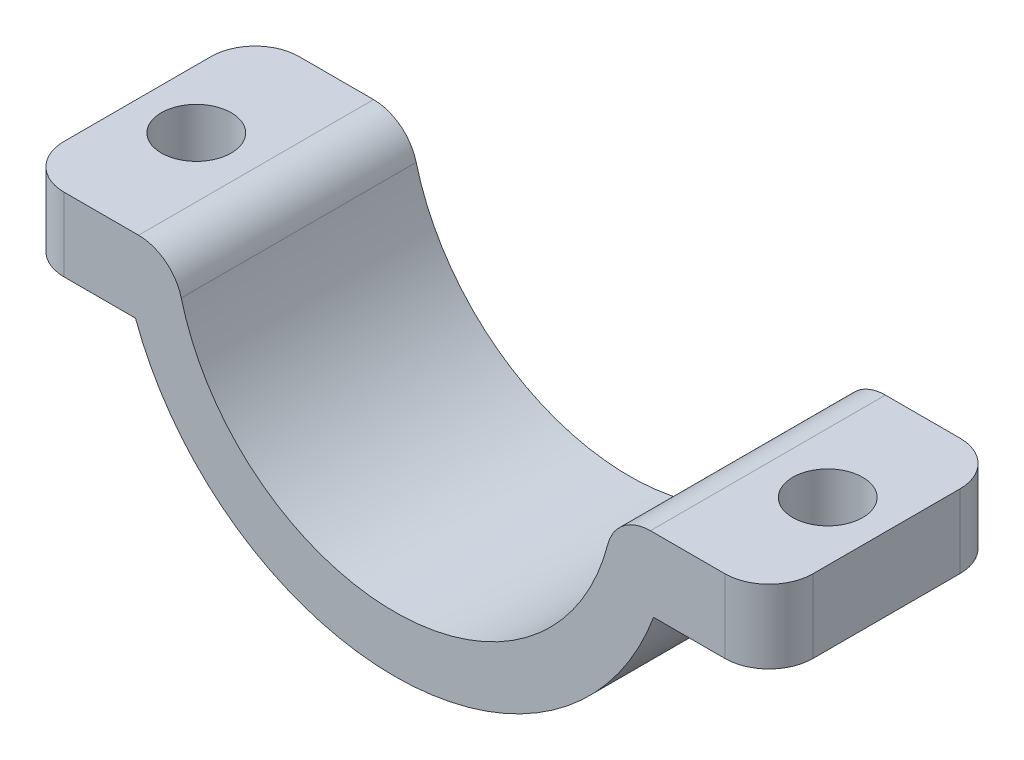
ISO-10303-21;
HEADER;
FILE_DESCRIPTION(('STEP AP214'),'2;1');
FILE_NAME('part.step','',(''),(''),'','','');
FILE_SCHEMA(('AUTOMOTIVE_DESIGN { 1 0 10303 214 1 1 1 1 }'));
ENDSEC;
DATA;
#1=APPLICATION_CONTEXT('core data for automotive mechanical design processes');
#2=APPLICATION_PROTOCOL_DEFINITION('international standard','automotive_design',2000,#1);
#3=PRODUCT_CONTEXT('',#1,'mechanical');
#4=PRODUCT('Part','Part','',(#3));
#5=PRODUCT_RELATED_PRODUCT_CATEGORY('part','',(#4));
#6=PRODUCT_DEFINITION_FORMATION('','',#4);
#7=PRODUCT_DEFINITION_CONTEXT('part definition',#1,'design');
#8=PRODUCT_DEFINITION('design','',#6,#7);
#9=PRODUCT_DEFINITION_SHAPE('','',#8);
#10=(LENGTH_UNIT() NAMED_UNIT(*) SI_UNIT(.MILLI.,.METRE.));
#11=(NAMED_UNIT(*) PLANE_ANGLE_UNIT() SI_UNIT($,.RADIAN.));
#12=(NAMED_UNIT(*) SI_UNIT($,.STERADIAN.) SOLID_ANGLE_UNIT());
#13=UNCERTAINTY_MEASURE_WITH_UNIT(LENGTH_MEASURE(1.E-05),#10,'distance_accuracy_value','');
#14=(GEOMETRIC_REPRESENTATION_CONTEXT(3) GLOBAL_UNCERTAINTY_ASSIGNED_CONTEXT((#13)) GLOBAL_UNIT_ASSIGNED_CONTEXT((#10,
#11,#12)) REPRESENTATION_CONTEXT('',''));
#15=CARTESIAN_POINT('',(0.,0.,0.));
#16=DIRECTION('',(0.,0.,1.));
#17=DIRECTION('',(1.,0.,0.));
#18=AXIS2_PLACEMENT_3D('',#15,#16,#17);
#19=CARTESIAN_POINT('',(0.,-1.5,8.));
#20=DIRECTION('',(0.,1.,0.));
#21=DIRECTION('',(-1.,0.,0.));
#22=AXIS2_PLACEMENT_3D('',#19,#20,#21);
#23=PLANE('',#22);
#24=CARTESIAN_POINT('',(21.5,-1.5,0.));
#25=DIRECTION('',(0.,1.,0.));
#26=DIRECTION('',(1.,0.,0.));
#27=AXIS2_PLACEMENT_3D('',#24,#25,#26);
#28=CIRCLE('',#27,2.38125);
#29=CARTESIAN_POINT('',(23.88125,-1.5,0.));
#30=VERTEX_POINT('',#29);
#31=EDGE_CURVE('E263',#30,#30,#28,.T.);
#32=ORIENTED_EDGE('',*,*,#31,.F.);
#33=EDGE_LOOP('',(#32));
#34=FACE_BOUND('',#33,.T.);
#35=DIRECTION('',(1.,0.,0.));
#36=VECTOR('',#35,1.);
#37=CARTESIAN_POINT('',(0.,-1.5,-8.));
#38=LINE('',#37,#36);
#39=CARTESIAN_POINT('',(17.4284250579334,-1.50000000000001,-8.));
#40=VERTEX_POINT('',#39);
#41=CARTESIAN_POINT('',(22.5,-1.50000000000001,-8.));
#42=VERTEX_POINT('',#41);
#43=EDGE_CURVE('E172',#40,#42,#38,.T.);
#44=ORIENTED_EDGE('',*,*,#43,.F.);
#45=DIRECTION('',(0.,0.,-1.));
#46=VECTOR('',#45,1.);
#47=CARTESIAN_POINT('',(17.4284250579334,-1.50000000000001,8.));
#48=LINE('',#47,#46);
#49=CARTESIAN_POINT('',(17.4284250579334,-1.50000000000001,8.));
#50=VERTEX_POINT('',#49);
#51=EDGE_CURVE('E222',#40,#50,#48,.F.);
#52=ORIENTED_EDGE('',*,*,#51,.T.);
#53=DIRECTION('',(1.,0.,0.));
#54=VECTOR('',#53,1.);
#55=CARTESIAN_POINT('',(0.,-1.5,8.));
#56=LINE('',#55,#54);
#57=CARTESIAN_POINT('',(22.5,-1.50000000000001,8.));
#58=VERTEX_POINT('',#57);
#59=EDGE_CURVE('E187',#50,#58,#56,.T.);
#60=ORIENTED_EDGE('',*,*,#59,.T.);
#61=CARTESIAN_POINT('',(22.5,-1.50000000000001,5.));
#62=DIRECTION('',(0.,1.,0.));
#63=DIRECTION('',(-1.,0.,0.));
#64=AXIS2_PLACEMENT_3D('',#61,#62,#63);
#65=CIRCLE('',#64,3.);
#66=CARTESIAN_POINT('',(25.5,-1.50000000000001,5.));
#67=VERTEX_POINT('',#66);
#68=EDGE_CURVE('E218',#58,#67,#65,.T.);
#69=ORIENTED_EDGE('',*,*,#68,.T.);
#70=DIRECTION('',(0.,0.,-1.));
#71=VECTOR('',#70,1.);
#72=CARTESIAN_POINT('',(25.5,-1.50000000000001,8.));
#73=LINE('',#72,#71);
#74=CARTESIAN_POINT('',(25.5,-1.50000000000001,-5.));
#75=VERTEX_POINT('',#74);
#76=EDGE_CURVE('E171',#67,#75,#73,.T.);
#77=ORIENTED_EDGE('',*,*,#76,.T.);
#78=CARTESIAN_POINT('',(22.5,-1.50000000000001,-5.));
#79=DIRECTION('',(0.,1.,0.));
#80=DIRECTION('',(-1.,0.,0.));
#81=AXIS2_PLACEMENT_3D('',#78,#79,#80);
#82=CIRCLE('',#81,3.);
#83=EDGE_CURVE('E220',#75,#42,#82,.T.);
#84=ORIENTED_EDGE('',*,*,#83,.T.);
#85=EDGE_LOOP('',(#44,#52,#60,#69,#77,#84));
#86=FACE_BOUND('',#85,.T.);
#87=ADVANCED_FACE('F35',(#34,#86),#23,.T.);
#88=CARTESIAN_POINT('',(0.,0.,8.));
#89=DIRECTION('',(0.,0.,-1.));
#90=DIRECTION('',(-1.,0.,0.));
#91=AXIS2_PLACEMENT_3D('',#88,#89,#90);
#92=CYLINDRICAL_SURFACE('',#91,15.);
#93=CARTESIAN_POINT('',(0.,0.,8.));
#94=DIRECTION('',(0.,0.,1.));
#95=DIRECTION('',(1.,0.,0.));
#96=AXIS2_PLACEMENT_3D('',#93,#94,#95);
#97=CIRCLE('',#96,15.);
#98=CARTESIAN_POINT('',(-14.5236875482778,-3.75000000000001,8.));
#99=VERTEX_POINT('',#98);
#100=CARTESIAN_POINT('',(14.5236875482778,-3.75000000000001,8.));
#101=VERTEX_POINT('',#100);
#102=EDGE_CURVE('E166',#99,#101,#97,.T.);
#103=ORIENTED_EDGE('',*,*,#102,.T.);
#104=DIRECTION('',(0.,0.,-1.));
#105=VECTOR('',#104,1.);
#106=CARTESIAN_POINT('',(14.5236875482778,-3.75000000000001,8.));
#107=LINE('',#106,#105);
#108=CARTESIAN_POINT('',(14.5236875482778,-3.75000000000001,-8.));
#109=VERTEX_POINT('',#108);
#110=EDGE_CURVE('E206',#101,#109,#107,.T.);
#111=ORIENTED_EDGE('',*,*,#110,.T.);
#112=CARTESIAN_POINT('',(0.,0.,-8.));
#113=DIRECTION('',(0.,0.,1.));
#114=DIRECTION('',(1.,0.,0.));
#115=AXIS2_PLACEMENT_3D('',#112,#113,#114);
#116=CIRCLE('',#115,15.);
#117=CARTESIAN_POINT('',(-14.5236875482778,-3.75000000000001,-8.));
#118=VERTEX_POINT('',#117);
#119=EDGE_CURVE('E175',#118,#109,#116,.T.);
#120=ORIENTED_EDGE('',*,*,#119,.F.);
#121=DIRECTION('',(0.,0.,-1.));
#122=VECTOR('',#121,1.);
#123=CARTESIAN_POINT('',(-14.5236875482778,-3.75000000000001,8.));
#124=LINE('',#123,#122);
#125=EDGE_CURVE('E198',#118,#99,#124,.F.);
#126=ORIENTED_EDGE('',*,*,#125,.T.);
#127=EDGE_LOOP('',(#103,#111,#120,#126));
#128=FACE_BOUND('',#127,.T.);
#129=ADVANCED_FACE('F275',(#128),#92,.F.);
#130=CARTESIAN_POINT('',(0.,-1.5,8.));
#131=DIRECTION('',(0.,-1.,0.));
#132=DIRECTION('',(1.,0.,0.));
#133=AXIS2_PLACEMENT_3D('',#130,#131,#132);
#134=PLANE('',#133);
#135=CARTESIAN_POINT('',(-21.5,-1.50000000000001,0.));
#136=DIRECTION('',(0.,1.,0.));
#137=DIRECTION('',(-1.,0.,0.));
#138=AXIS2_PLACEMENT_3D('',#135,#136,#137);
#139=CIRCLE('',#138,2.38125);
#140=CARTESIAN_POINT('',(-23.88125,-1.50000000000001,0.));
#141=VERTEX_POINT('',#140);
#142=EDGE_CURVE('E202',#141,#141,#139,.T.);
#143=ORIENTED_EDGE('',*,*,#142,.F.);
#144=EDGE_LOOP('',(#143));
#145=FACE_BOUND('',#144,.T.);
#146=DIRECTION('',(-1.,0.,0.));
#147=VECTOR('',#146,1.);
#148=CARTESIAN_POINT('',(0.,-1.5,8.));
#149=LINE('',#148,#147);
#150=CARTESIAN_POINT('',(-17.4284250579334,-1.50000000000001,8.));
#151=VERTEX_POINT('',#150);
#152=CARTESIAN_POINT('',(-22.5,-1.50000000000001,8.));
#153=VERTEX_POINT('',#152);
#154=EDGE_CURVE('E164',#151,#153,#149,.T.);
#155=ORIENTED_EDGE('',*,*,#154,.F.);
#156=DIRECTION('',(0.,0.,1.));
#157=VECTOR('',#156,1.);
#158=CARTESIAN_POINT('',(-17.4284250579334,-1.50000000000001,-8.));
#159=LINE('',#158,#157);
#160=CARTESIAN_POINT('',(-17.4284250579334,-1.50000000000001,-8.));
#161=VERTEX_POINT('',#160);
#162=EDGE_CURVE('E235',#151,#161,#159,.F.);
#163=ORIENTED_EDGE('',*,*,#162,.T.);
#164=DIRECTION('',(-1.,0.,0.));
#165=VECTOR('',#164,1.);
#166=CARTESIAN_POINT('',(0.,-1.5,-8.));
#167=LINE('',#166,#165);
#168=CARTESIAN_POINT('',(-22.5,-1.50000000000001,-8.));
#169=VERTEX_POINT('',#168);
#170=EDGE_CURVE('E179',#161,#169,#167,.T.);
#171=ORIENTED_EDGE('',*,*,#170,.T.);
#172=CARTESIAN_POINT('',(-22.5,-1.50000000000001,-5.));
#173=DIRECTION('',(0.,-1.,0.));
#174=DIRECTION('',(1.,0.,0.));
#175=AXIS2_PLACEMENT_3D('',#172,#173,#174);
#176=CIRCLE('',#175,3.);
#177=CARTESIAN_POINT('',(-25.5,-1.50000000000001,-5.));
#178=VERTEX_POINT('',#177);
#179=EDGE_CURVE('E231',#169,#178,#176,.F.);
#180=ORIENTED_EDGE('',*,*,#179,.T.);
#181=DIRECTION('',(0.,0.,-1.));
#182=VECTOR('',#181,1.);
#183=CARTESIAN_POINT('',(-25.5,-1.50000000000001,8.));
#184=LINE('',#183,#182);
#185=CARTESIAN_POINT('',(-25.5,-1.50000000000001,5.));
#186=VERTEX_POINT('',#185);
#187=EDGE_CURVE('E195',#186,#178,#184,.T.);
#188=ORIENTED_EDGE('',*,*,#187,.F.);
#189=CARTESIAN_POINT('',(-22.5,-1.50000000000001,5.));
#190=DIRECTION('',(0.,-1.,0.));
#191=DIRECTION('',(1.,0.,0.));
#192=AXIS2_PLACEMENT_3D('',#189,#190,#191);
#193=CIRCLE('',#192,3.);
#194=EDGE_CURVE('E233',#186,#153,#193,.F.);
#195=ORIENTED_EDGE('',*,*,#194,.T.);
#196=EDGE_LOOP('',(#155,#163,#171,#180,#188,#195));
#197=FACE_BOUND('',#196,.T.);
#198=ADVANCED_FACE('F271',(#145,#197),#134,.F.);
#199=CARTESIAN_POINT('',(-25.5,0.,8.));
#200=DIRECTION('',(1.,0.,0.));
#201=DIRECTION('',(0.,0.,-1.));
#202=AXIS2_PLACEMENT_3D('',#199,#200,#201);
#203=PLANE('',#202);
#204=DIRECTION('',(0.,0.,-1.));
#205=VECTOR('',#204,1.);
#206=CARTESIAN_POINT('',(-25.5,-6.50000000000001,8.));
#207=LINE('',#206,#205);
#208=CARTESIAN_POINT('',(-25.5,-6.50000000000001,5.));
#209=VERTEX_POINT('',#208);
#210=CARTESIAN_POINT('',(-25.5,-6.50000000000001,-5.));
#211=VERTEX_POINT('',#210);
#212=EDGE_CURVE('E146',#209,#211,#207,.T.);
#213=ORIENTED_EDGE('',*,*,#212,.F.);
#214=DIRECTION('',(0.,-1.,0.));
#215=VECTOR('',#214,1.);
#216=CARTESIAN_POINT('',(-25.5,-1.50000000000001,5.));
#217=LINE('',#216,#215);
#218=EDGE_CURVE('E245',#209,#186,#217,.F.);
#219=ORIENTED_EDGE('',*,*,#218,.T.);
#220=ORIENTED_EDGE('',*,*,#187,.T.);
#221=DIRECTION('',(0.,-1.,0.));
#222=VECTOR('',#221,1.);
#223=CARTESIAN_POINT('',(-25.5,0.,-5.));
#224=LINE('',#223,#222);
#225=EDGE_CURVE('E242',#178,#211,#224,.T.);
#226=ORIENTED_EDGE('',*,*,#225,.T.);
#227=EDGE_LOOP('',(#213,#219,#220,#226));
#228=FACE_BOUND('',#227,.T.);
#229=ADVANCED_FACE('F274',(#228),#203,.F.);
#230=CARTESIAN_POINT('',(0.,-6.5,8.));
#231=DIRECTION('',(0.,-1.,0.));
#232=DIRECTION('',(1.,0.,0.));
#233=AXIS2_PLACEMENT_3D('',#230,#231,#232);
#234=PLANE('',#233);
#235=CARTESIAN_POINT('',(-21.5,-6.50000000000001,0.));
#236=DIRECTION('',(0.,-1.,0.));
#237=DIRECTION('',(1.,0.,0.));
#238=AXIS2_PLACEMENT_3D('',#235,#236,#237);
#239=CIRCLE('',#238,2.38125);
#240=CARTESIAN_POINT('',(-19.11875,-6.50000000000001,0.));
#241=VERTEX_POINT('',#240);
#242=EDGE_CURVE('E176',#241,#241,#239,.T.);
#243=ORIENTED_EDGE('',*,*,#242,.F.);
#244=EDGE_LOOP('',(#243));
#245=FACE_BOUND('',#244,.T.);
#246=DIRECTION('',(-1.,0.,0.));
#247=VECTOR('',#246,1.);
#248=CARTESIAN_POINT('',(0.,-6.5,8.));
#249=LINE('',#248,#247);
#250=CARTESIAN_POINT('',(-17.6405782218157,-6.50000000000001,8.));
#251=VERTEX_POINT('',#250);
#252=CARTESIAN_POINT('',(-22.5,-6.50000000000001,8.));
#253=VERTEX_POINT('',#252);
#254=EDGE_CURVE('E141',#251,#253,#249,.T.);
#255=ORIENTED_EDGE('',*,*,#254,.T.);
#256=CARTESIAN_POINT('',(-22.5,-6.50000000000001,5.));
#257=DIRECTION('',(0.,-1.,0.));
#258=DIRECTION('',(1.,0.,0.));
#259=AXIS2_PLACEMENT_3D('',#256,#257,#258);
#260=CIRCLE('',#259,3.);
#261=EDGE_CURVE('E240',#253,#209,#260,.T.);
#262=ORIENTED_EDGE('',*,*,#261,.T.);
#263=ORIENTED_EDGE('',*,*,#212,.T.);
#264=CARTESIAN_POINT('',(-22.5,-6.50000000000001,-5.));
#265=DIRECTION('',(0.,-1.,0.));
#266=DIRECTION('',(1.,0.,0.));
#267=AXIS2_PLACEMENT_3D('',#264,#265,#266);
#268=CIRCLE('',#267,3.);
#269=CARTESIAN_POINT('',(-22.5,-6.50000000000001,-8.));
#270=VERTEX_POINT('',#269);
#271=EDGE_CURVE('E238',#211,#270,#268,.T.);
#272=ORIENTED_EDGE('',*,*,#271,.T.);
#273=DIRECTION('',(-1.,0.,0.));
#274=VECTOR('',#273,1.);
#275=CARTESIAN_POINT('',(0.,-6.5,-8.));
#276=LINE('',#275,#274);
#277=CARTESIAN_POINT('',(-17.6405782218157,-6.50000000000001,-8.));
#278=VERTEX_POINT('',#277);
#279=EDGE_CURVE('E143',#278,#270,#276,.T.);
#280=ORIENTED_EDGE('',*,*,#279,.F.);
#281=DIRECTION('',(0.,0.,-1.));
#282=VECTOR('',#281,1.);
#283=CARTESIAN_POINT('',(-17.6405782218157,-6.50000000000001,8.));
#284=LINE('',#283,#282);
#285=EDGE_CURVE('E137',#251,#278,#284,.T.);
#286=ORIENTED_EDGE('',*,*,#285,.F.);
#287=EDGE_LOOP('',(#255,#262,#263,#272,#280,#286));
#288=FACE_BOUND('',#287,.T.);
#289=ADVANCED_FACE('F139',(#245,#288),#234,.T.);
#290=CARTESIAN_POINT('',(0.,0.,8.));
#291=DIRECTION('',(0.,0.,-1.));
#292=DIRECTION('',(-1.,0.,0.));
#293=AXIS2_PLACEMENT_3D('',#290,#291,#292);
#294=CYLINDRICAL_SURFACE('',#293,18.8);
#295=CARTESIAN_POINT('',(0.,0.,-8.));
#296=DIRECTION('',(0.,0.,1.));
#297=DIRECTION('',(1.,0.,0.));
#298=AXIS2_PLACEMENT_3D('',#295,#296,#297);
#299=CIRCLE('',#298,18.8);
#300=CARTESIAN_POINT('',(17.6405782218157,-6.50000000000001,-8.));
#301=VERTEX_POINT('',#300);
#302=EDGE_CURVE('E183',#278,#301,#299,.T.);
#303=ORIENTED_EDGE('',*,*,#302,.T.);
#304=DIRECTION('',(0.,0.,-1.));
#305=VECTOR('',#304,1.);
#306=CARTESIAN_POINT('',(17.6405782218157,-6.50000000000001,8.));
#307=LINE('',#306,#305);
#308=CARTESIAN_POINT('',(17.6405782218157,-6.50000000000001,8.));
#309=VERTEX_POINT('',#308);
#310=EDGE_CURVE('E147',#309,#301,#307,.T.);
#311=ORIENTED_EDGE('',*,*,#310,.F.);
#312=CARTESIAN_POINT('',(0.,0.,8.));
#313=DIRECTION('',(0.,0.,1.));
#314=DIRECTION('',(1.,0.,0.));
#315=AXIS2_PLACEMENT_3D('',#312,#313,#314);
#316=CIRCLE('',#315,18.8);
#317=EDGE_CURVE('E150',#251,#309,#316,.T.);
#318=ORIENTED_EDGE('',*,*,#317,.F.);
#319=ORIENTED_EDGE('',*,*,#285,.T.);
#320=EDGE_LOOP('',(#303,#311,#318,#319));
#321=FACE_BOUND('',#320,.T.);
#322=ADVANCED_FACE('F151',(#321),#294,.T.);
#323=CARTESIAN_POINT('',(0.,-6.5,8.));
#324=DIRECTION('',(0.,1.,0.));
#325=DIRECTION('',(-1.,0.,0.));
#326=AXIS2_PLACEMENT_3D('',#323,#324,#325);
#327=PLANE('',#326);
#328=CARTESIAN_POINT('',(21.5,-6.50000000000001,0.));
#329=DIRECTION('',(0.,1.,0.));
#330=DIRECTION('',(-1.,0.,0.));
#331=AXIS2_PLACEMENT_3D('',#328,#329,#330);
#332=CIRCLE('',#331,2.38125);
#333=CARTESIAN_POINT('',(19.11875,-6.50000000000001,0.));
#334=VERTEX_POINT('',#333);
#335=EDGE_CURVE('E199',#334,#334,#332,.T.);
#336=ORIENTED_EDGE('',*,*,#335,.T.);
#337=EDGE_LOOP('',(#336));
#338=FACE_BOUND('',#337,.T.);
#339=DIRECTION('',(1.,0.,0.));
#340=VECTOR('',#339,1.);
#341=CARTESIAN_POINT('',(0.,-6.5,-8.));
#342=LINE('',#341,#340);
#343=CARTESIAN_POINT('',(22.5,-6.50000000000001,-8.));
#344=VERTEX_POINT('',#343);
#345=EDGE_CURVE('E185',#301,#344,#342,.T.);
#346=ORIENTED_EDGE('',*,*,#345,.T.);
#347=CARTESIAN_POINT('',(22.5,-6.50000000000001,-5.));
#348=DIRECTION('',(0.,1.,0.));
#349=DIRECTION('',(-1.,0.,0.));
#350=AXIS2_PLACEMENT_3D('',#347,#348,#349);
#351=CIRCLE('',#350,3.);
#352=CARTESIAN_POINT('',(25.5,-6.50000000000001,-5.));
#353=VERTEX_POINT('',#352);
#354=EDGE_CURVE('E50',#344,#353,#351,.F.);
#355=ORIENTED_EDGE('',*,*,#354,.T.);
#356=DIRECTION('',(0.,0.,-1.));
#357=VECTOR('',#356,1.);
#358=CARTESIAN_POINT('',(25.5,-6.50000000000001,8.));
#359=LINE('',#358,#357);
#360=CARTESIAN_POINT('',(25.5,-6.50000000000001,5.));
#361=VERTEX_POINT('',#360);
#362=EDGE_CURVE('E190',#361,#353,#359,.T.);
#363=ORIENTED_EDGE('',*,*,#362,.F.);
#364=CARTESIAN_POINT('',(22.5,-6.50000000000001,5.));
#365=DIRECTION('',(0.,1.,0.));
#366=DIRECTION('',(-1.,0.,0.));
#367=AXIS2_PLACEMENT_3D('',#364,#365,#366);
#368=CIRCLE('',#367,3.);
#369=CARTESIAN_POINT('',(22.5,-6.50000000000001,8.));
#370=VERTEX_POINT('',#369);
#371=EDGE_CURVE('E58',#361,#370,#368,.F.);
#372=ORIENTED_EDGE('',*,*,#371,.T.);
#373=DIRECTION('',(1.,0.,0.));
#374=VECTOR('',#373,1.);
#375=CARTESIAN_POINT('',(0.,-6.5,8.));
#376=LINE('',#375,#374);
#377=EDGE_CURVE('E156',#309,#370,#376,.T.);
#378=ORIENTED_EDGE('',*,*,#377,.F.);
#379=ORIENTED_EDGE('',*,*,#310,.T.);
#380=EDGE_LOOP('',(#346,#355,#363,#372,#378,#379));
#381=FACE_BOUND('',#380,.T.);
#382=ADVANCED_FACE('F253',(#338,#381),#327,.F.);
#383=CARTESIAN_POINT('',(25.5,0.,8.));
#384=DIRECTION('',(1.,0.,0.));
#385=DIRECTION('',(0.,0.,-1.));
#386=AXIS2_PLACEMENT_3D('',#383,#384,#385);
#387=PLANE('',#386);
#388=ORIENTED_EDGE('',*,*,#362,.T.);
#389=DIRECTION('',(0.,-1.,0.));
#390=VECTOR('',#389,1.);
#391=CARTESIAN_POINT('',(25.5,-1.50000000000001,-5.));
#392=LINE('',#391,#390);
#393=EDGE_CURVE('E11',#353,#75,#392,.F.);
#394=ORIENTED_EDGE('',*,*,#393,.T.);
#395=ORIENTED_EDGE('',*,*,#76,.F.);
#396=DIRECTION('',(0.,-1.,0.));
#397=VECTOR('',#396,1.);
#398=CARTESIAN_POINT('',(25.5,0.,5.));
#399=LINE('',#398,#397);
#400=EDGE_CURVE('E43',#67,#361,#399,.T.);
#401=ORIENTED_EDGE('',*,*,#400,.T.);
#402=EDGE_LOOP('',(#388,#394,#395,#401));
#403=FACE_BOUND('',#402,.T.);
#404=ADVANCED_FACE('F250',(#403),#387,.T.);
#405=CARTESIAN_POINT('',(0.,0.,8.));
#406=DIRECTION('',(0.,0.,1.));
#407=DIRECTION('',(1.,0.,0.));
#408=AXIS2_PLACEMENT_3D('',#405,#406,#407);
#409=PLANE('',#408);
#410=ORIENTED_EDGE('',*,*,#59,.F.);
#411=CARTESIAN_POINT('',(17.4284250579334,-4.50000000000001,8.));
#412=DIRECTION('',(0.,0.,1.));
#413=DIRECTION('',(1.,0.,0.));
#414=AXIS2_PLACEMENT_3D('',#411,#412,#413);
#415=CIRCLE('',#414,3.);
#416=EDGE_CURVE('E229',#50,#101,#415,.T.);
#417=ORIENTED_EDGE('',*,*,#416,.T.);
#418=ORIENTED_EDGE('',*,*,#102,.F.);
#419=CARTESIAN_POINT('',(-17.4284250579334,-4.50000000000001,8.));
#420=DIRECTION('',(0.,0.,1.));
#421=DIRECTION('',(1.,0.,0.));
#422=AXIS2_PLACEMENT_3D('',#419,#420,#421);
#423=CIRCLE('',#422,3.);
#424=EDGE_CURVE('E227',#99,#151,#423,.T.);
#425=ORIENTED_EDGE('',*,*,#424,.T.);
#426=ORIENTED_EDGE('',*,*,#154,.T.);
#427=DIRECTION('',(0.,-1.,0.));
#428=VECTOR('',#427,1.);
#429=CARTESIAN_POINT('',(-22.5,-6.50000000000001,8.));
#430=LINE('',#429,#428);
#431=EDGE_CURVE('E163',#153,#253,#430,.T.);
#432=ORIENTED_EDGE('',*,*,#431,.T.);
#433=ORIENTED_EDGE('',*,*,#254,.F.);
#434=ORIENTED_EDGE('',*,*,#317,.T.);
#435=ORIENTED_EDGE('',*,*,#377,.T.);
#436=DIRECTION('',(0.,-1.,0.));
#437=VECTOR('',#436,1.);
#438=CARTESIAN_POINT('',(22.5,0.,8.));
#439=LINE('',#438,#437);
#440=EDGE_CURVE('E224',#370,#58,#439,.F.);
#441=ORIENTED_EDGE('',*,*,#440,.T.);
#442=EDGE_LOOP('',(#410,#417,#418,#425,#426,#432,#433,#434,#435,#441));
#443=FACE_BOUND('',#442,.T.);
#444=ADVANCED_FACE('F160',(#443),#409,.T.);
#445=CARTESIAN_POINT('',(0.,0.,-8.));
#446=DIRECTION('',(0.,0.,1.));
#447=DIRECTION('',(1.,0.,0.));
#448=AXIS2_PLACEMENT_3D('',#445,#446,#447);
#449=PLANE('',#448);
#450=ORIENTED_EDGE('',*,*,#119,.T.);
#451=CARTESIAN_POINT('',(17.4284250579334,-4.50000000000001,-8.));
#452=DIRECTION('',(0.,0.,1.));
#453=DIRECTION('',(1.,0.,0.));
#454=AXIS2_PLACEMENT_3D('',#451,#452,#453);
#455=CIRCLE('',#454,3.);
#456=EDGE_CURVE('E216',#109,#40,#455,.F.);
#457=ORIENTED_EDGE('',*,*,#456,.T.);
#458=ORIENTED_EDGE('',*,*,#43,.T.);
#459=DIRECTION('',(0.,-1.,0.));
#460=VECTOR('',#459,1.);
#461=CARTESIAN_POINT('',(22.5,-6.50000000000001,-8.));
#462=LINE('',#461,#460);
#463=EDGE_CURVE('E209',#42,#344,#462,.T.);
#464=ORIENTED_EDGE('',*,*,#463,.T.);
#465=ORIENTED_EDGE('',*,*,#345,.F.);
#466=ORIENTED_EDGE('',*,*,#302,.F.);
#467=ORIENTED_EDGE('',*,*,#279,.T.);
#468=DIRECTION('',(0.,-1.,0.));
#469=VECTOR('',#468,1.);
#470=CARTESIAN_POINT('',(-22.5,0.,-8.));
#471=LINE('',#470,#469);
#472=EDGE_CURVE('E212',#270,#169,#471,.F.);
#473=ORIENTED_EDGE('',*,*,#472,.T.);
#474=ORIENTED_EDGE('',*,*,#170,.F.);
#475=CARTESIAN_POINT('',(-17.4284250579334,-4.50000000000001,-8.));
#476=DIRECTION('',(0.,0.,1.));
#477=DIRECTION('',(1.,0.,0.));
#478=AXIS2_PLACEMENT_3D('',#475,#476,#477);
#479=CIRCLE('',#478,3.);
#480=EDGE_CURVE('E214',#161,#118,#479,.F.);
#481=ORIENTED_EDGE('',*,*,#480,.T.);
#482=EDGE_LOOP('',(#450,#457,#458,#464,#465,#466,#467,#473,#474,#481));
#483=FACE_BOUND('',#482,.T.);
#484=ADVANCED_FACE('F288',(#483),#449,.F.);
#485=CARTESIAN_POINT('',(21.5,-17.5,0.));
#486=DIRECTION('',(0.,1.,0.));
#487=DIRECTION('',(-1.,0.,0.));
#488=AXIS2_PLACEMENT_3D('',#485,#486,#487);
#489=CYLINDRICAL_SURFACE('',#488,2.38125);
#490=ORIENTED_EDGE('',*,*,#31,.T.);
#491=EDGE_LOOP('',(#490));
#492=FACE_BOUND('',#491,.T.);
#493=ORIENTED_EDGE('',*,*,#335,.F.);
#494=EDGE_LOOP('',(#493));
#495=FACE_BOUND('',#494,.T.);
#496=ADVANCED_FACE('F329',(#492,#495),#489,.F.);
#497=CARTESIAN_POINT('',(-21.5,-17.5,0.));
#498=DIRECTION('',(0.,1.,0.));
#499=DIRECTION('',(-1.,0.,0.));
#500=AXIS2_PLACEMENT_3D('',#497,#498,#499);
#501=CYLINDRICAL_SURFACE('',#500,2.38125);
#502=ORIENTED_EDGE('',*,*,#242,.T.);
#503=EDGE_LOOP('',(#502));
#504=FACE_BOUND('',#503,.T.);
#505=ORIENTED_EDGE('',*,*,#142,.T.);
#506=EDGE_LOOP('',(#505));
#507=FACE_BOUND('',#506,.T.);
#508=ADVANCED_FACE('F269',(#504,#507),#501,.F.);
#509=CARTESIAN_POINT('',(17.4284250579334,-4.50000000000001,8.));
#510=DIRECTION('',(0.,0.,-1.));
#511=DIRECTION('',(-1.,0.,0.));
#512=AXIS2_PLACEMENT_3D('',#509,#510,#511);
#513=CYLINDRICAL_SURFACE('',#512,3.);
#514=ORIENTED_EDGE('',*,*,#416,.F.);
#515=ORIENTED_EDGE('',*,*,#51,.F.);
#516=ORIENTED_EDGE('',*,*,#456,.F.);
#517=ORIENTED_EDGE('',*,*,#110,.F.);
#518=EDGE_LOOP('',(#514,#515,#516,#517));
#519=FACE_BOUND('',#518,.T.);
#520=ADVANCED_FACE('F293',(#519),#513,.T.);
#521=CARTESIAN_POINT('',(-17.4284250579334,-4.50000000000001,8.));
#522=DIRECTION('',(0.,0.,-1.));
#523=DIRECTION('',(-1.,0.,0.));
#524=AXIS2_PLACEMENT_3D('',#521,#522,#523);
#525=CYLINDRICAL_SURFACE('',#524,3.);
#526=ORIENTED_EDGE('',*,*,#424,.F.);
#527=ORIENTED_EDGE('',*,*,#125,.F.);
#528=ORIENTED_EDGE('',*,*,#480,.F.);
#529=ORIENTED_EDGE('',*,*,#162,.F.);
#530=EDGE_LOOP('',(#526,#527,#528,#529));
#531=FACE_BOUND('',#530,.T.);
#532=ADVANCED_FACE('F284',(#531),#525,.T.);
#533=CARTESIAN_POINT('',(-22.5,0.,5.));
#534=DIRECTION('',(0.,1.,0.));
#535=DIRECTION('',(0.,0.,1.));
#536=AXIS2_PLACEMENT_3D('',#533,#534,#535);
#537=CYLINDRICAL_SURFACE('',#536,3.);
#538=ORIENTED_EDGE('',*,*,#194,.F.);
#539=ORIENTED_EDGE('',*,*,#218,.F.);
#540=ORIENTED_EDGE('',*,*,#261,.F.);
#541=ORIENTED_EDGE('',*,*,#431,.F.);
#542=EDGE_LOOP('',(#538,#539,#540,#541));
#543=FACE_BOUND('',#542,.T.);
#544=ADVANCED_FACE('F307',(#543),#537,.T.);
#545=CARTESIAN_POINT('',(-22.5,0.,-5.));
#546=DIRECTION('',(0.,-1.,0.));
#547=DIRECTION('',(0.,0.,-1.));
#548=AXIS2_PLACEMENT_3D('',#545,#546,#547);
#549=CYLINDRICAL_SURFACE('',#548,3.);
#550=ORIENTED_EDGE('',*,*,#179,.F.);
#551=ORIENTED_EDGE('',*,*,#472,.F.);
#552=ORIENTED_EDGE('',*,*,#271,.F.);
#553=ORIENTED_EDGE('',*,*,#225,.F.);
#554=EDGE_LOOP('',(#550,#551,#552,#553));
#555=FACE_BOUND('',#554,.T.);
#556=ADVANCED_FACE('F301',(#555),#549,.T.);
#557=CARTESIAN_POINT('',(22.5,0.,-5.));
#558=DIRECTION('',(0.,1.,0.));
#559=DIRECTION('',(0.,0.,1.));
#560=AXIS2_PLACEMENT_3D('',#557,#558,#559);
#561=CYLINDRICAL_SURFACE('',#560,3.);
#562=ORIENTED_EDGE('',*,*,#83,.F.);
#563=ORIENTED_EDGE('',*,*,#393,.F.);
#564=ORIENTED_EDGE('',*,*,#354,.F.);
#565=ORIENTED_EDGE('',*,*,#463,.F.);
#566=EDGE_LOOP('',(#562,#563,#564,#565));
#567=FACE_BOUND('',#566,.T.);
#568=ADVANCED_FACE('F296',(#567),#561,.T.);
#569=CARTESIAN_POINT('',(22.5,0.,5.));
#570=DIRECTION('',(0.,-1.,0.));
#571=DIRECTION('',(0.,0.,-1.));
#572=AXIS2_PLACEMENT_3D('',#569,#570,#571);
#573=CYLINDRICAL_SURFACE('',#572,3.);
#574=ORIENTED_EDGE('',*,*,#68,.F.);
#575=ORIENTED_EDGE('',*,*,#440,.F.);
#576=ORIENTED_EDGE('',*,*,#371,.F.);
#577=ORIENTED_EDGE('',*,*,#400,.F.);
#578=EDGE_LOOP('',(#574,#575,#576,#577));
#579=FACE_BOUND('',#578,.T.);
#580=ADVANCED_FACE('F37',(#579),#573,.T.);
#581=CLOSED_SHELL('',(#87,#129,#198,#229,#289,#322,#382,#404,#444,#484,#496,#508,#520,#532,#544,
#556,#568,#580));
#582=MANIFOLD_SOLID_BREP('B2',#581);
#583=ADVANCED_BREP_SHAPE_REPRESENTATION('',(#18,#582),#14);
#584=SHAPE_DEFINITION_REPRESENTATION(#9,#583);
ENDSEC;
END-ISO-10303-21;
